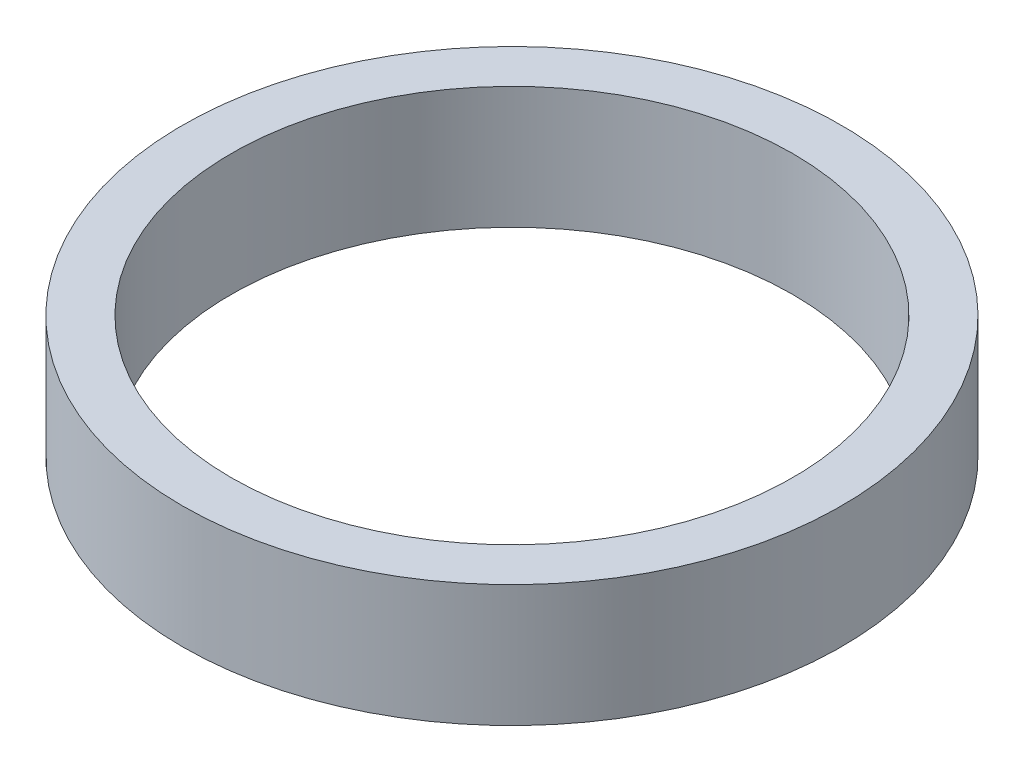
ISO-10303-21;
HEADER;
FILE_DESCRIPTION(('STEP AP214'),'2;1');
FILE_NAME('part.step','',(''),(''),'','','');
FILE_SCHEMA(('AUTOMOTIVE_DESIGN { 1 0 10303 214 1 1 1 1 }'));
ENDSEC;
DATA;
#1=APPLICATION_CONTEXT('core data for automotive mechanical design processes');
#2=APPLICATION_PROTOCOL_DEFINITION('international standard','automotive_design',2000,#1);
#3=PRODUCT_CONTEXT('',#1,'mechanical');
#4=PRODUCT('Part','Part','',(#3));
#5=PRODUCT_RELATED_PRODUCT_CATEGORY('part','',(#4));
#6=PRODUCT_DEFINITION_FORMATION('','',#4);
#7=PRODUCT_DEFINITION_CONTEXT('part definition',#1,'design');
#8=PRODUCT_DEFINITION('design','',#6,#7);
#9=PRODUCT_DEFINITION_SHAPE('','',#8);
#10=(LENGTH_UNIT() NAMED_UNIT(*) SI_UNIT(.MILLI.,.METRE.));
#11=(NAMED_UNIT(*) PLANE_ANGLE_UNIT() SI_UNIT($,.RADIAN.));
#12=(NAMED_UNIT(*) SI_UNIT($,.STERADIAN.) SOLID_ANGLE_UNIT());
#13=UNCERTAINTY_MEASURE_WITH_UNIT(LENGTH_MEASURE(1.E-05),#10,'distance_accuracy_value','');
#14=(GEOMETRIC_REPRESENTATION_CONTEXT(3) GLOBAL_UNCERTAINTY_ASSIGNED_CONTEXT((#13)) GLOBAL_UNIT_ASSIGNED_CONTEXT((#10,
#11,#12)) REPRESENTATION_CONTEXT('',''));
#15=CARTESIAN_POINT('',(0.,0.,0.));
#16=DIRECTION('',(0.,0.,1.));
#17=DIRECTION('',(1.,0.,0.));
#18=AXIS2_PLACEMENT_3D('',#15,#16,#17);
#19=CARTESIAN_POINT('',(0.,5.,0.));
#20=DIRECTION('',(0.,-1.,0.));
#21=DIRECTION('',(0.,0.,-1.));
#22=AXIS2_PLACEMENT_3D('',#19,#20,#21);
#23=CYLINDRICAL_SURFACE('',#22,13.5);
#24=CARTESIAN_POINT('',(0.,5.,0.));
#25=DIRECTION('',(0.,1.,0.));
#26=DIRECTION('',(0.,0.,1.));
#27=AXIS2_PLACEMENT_3D('',#24,#25,#26);
#28=CIRCLE('',#27,13.5);
#29=CARTESIAN_POINT('',(0.,5.,13.5));
#30=VERTEX_POINT('',#29);
#31=EDGE_CURVE('E10',#30,#30,#28,.T.);
#32=ORIENTED_EDGE('',*,*,#31,.F.);
#33=EDGE_LOOP('',(#32));
#34=FACE_BOUND('',#33,.T.);
#35=CARTESIAN_POINT('',(0.,0.,0.));
#36=DIRECTION('',(0.,1.,0.));
#37=DIRECTION('',(0.,0.,1.));
#38=AXIS2_PLACEMENT_3D('',#35,#36,#37);
#39=CIRCLE('',#38,13.5);
#40=CARTESIAN_POINT('',(0.,0.,13.5));
#41=VERTEX_POINT('',#40);
#42=EDGE_CURVE('E46',#41,#41,#39,.T.);
#43=ORIENTED_EDGE('',*,*,#42,.T.);
#44=EDGE_LOOP('',(#43));
#45=FACE_BOUND('',#44,.T.);
#46=ADVANCED_FACE('F43',(#34,#45),#23,.T.);
#47=CARTESIAN_POINT('',(0.,5.,0.));
#48=DIRECTION('',(0.,1.,0.));
#49=DIRECTION('',(0.,0.,1.));
#50=AXIS2_PLACEMENT_3D('',#47,#48,#49);
#51=PLANE('',#50);
#52=CARTESIAN_POINT('',(0.,5.,0.));
#53=DIRECTION('',(0.,1.,0.));
#54=DIRECTION('',(0.,0.,1.));
#55=AXIS2_PLACEMENT_3D('',#52,#53,#54);
#56=CIRCLE('',#55,11.5);
#57=CARTESIAN_POINT('',(0.,5.,11.5));
#58=VERTEX_POINT('',#57);
#59=EDGE_CURVE('E57',#58,#58,#56,.T.);
#60=ORIENTED_EDGE('',*,*,#59,.F.);
#61=EDGE_LOOP('',(#60));
#62=FACE_BOUND('',#61,.T.);
#63=ORIENTED_EDGE('',*,*,#31,.T.);
#64=EDGE_LOOP('',(#63));
#65=FACE_BOUND('',#64,.T.);
#66=ADVANCED_FACE('F74',(#62,#65),#51,.T.);
#67=CARTESIAN_POINT('',(0.,0.,0.));
#68=DIRECTION('',(0.,1.,0.));
#69=DIRECTION('',(0.,0.,1.));
#70=AXIS2_PLACEMENT_3D('',#67,#68,#69);
#71=PLANE('',#70);
#72=CARTESIAN_POINT('',(0.,0.,0.));
#73=DIRECTION('',(0.,1.,0.));
#74=DIRECTION('',(0.,0.,1.));
#75=AXIS2_PLACEMENT_3D('',#72,#73,#74);
#76=CIRCLE('',#75,11.5);
#77=CARTESIAN_POINT('',(0.,0.,11.5));
#78=VERTEX_POINT('',#77);
#79=EDGE_CURVE('E55',#78,#78,#76,.T.);
#80=ORIENTED_EDGE('',*,*,#79,.T.);
#81=EDGE_LOOP('',(#80));
#82=FACE_BOUND('',#81,.T.);
#83=ORIENTED_EDGE('',*,*,#42,.F.);
#84=EDGE_LOOP('',(#83));
#85=FACE_BOUND('',#84,.T.);
#86=ADVANCED_FACE('F65',(#82,#85),#71,.F.);
#87=CARTESIAN_POINT('',(0.,0.,0.));
#88=DIRECTION('',(0.,1.,0.));
#89=DIRECTION('',(0.,0.,1.));
#90=AXIS2_PLACEMENT_3D('',#87,#88,#89);
#91=CYLINDRICAL_SURFACE('',#90,11.5);
#92=ORIENTED_EDGE('',*,*,#79,.F.);
#93=EDGE_LOOP('',(#92));
#94=FACE_BOUND('',#93,.T.);
#95=ORIENTED_EDGE('',*,*,#59,.T.);
#96=EDGE_LOOP('',(#95));
#97=FACE_BOUND('',#96,.T.);
#98=ADVANCED_FACE('F68',(#94,#97),#91,.F.);
#99=CLOSED_SHELL('',(#46,#66,#86,#98));
#100=MANIFOLD_SOLID_BREP('B2',#99);
#101=ADVANCED_BREP_SHAPE_REPRESENTATION('',(#18,#100),#14);
#102=SHAPE_DEFINITION_REPRESENTATION(#9,#101);
ENDSEC;
END-ISO-10303-21;
